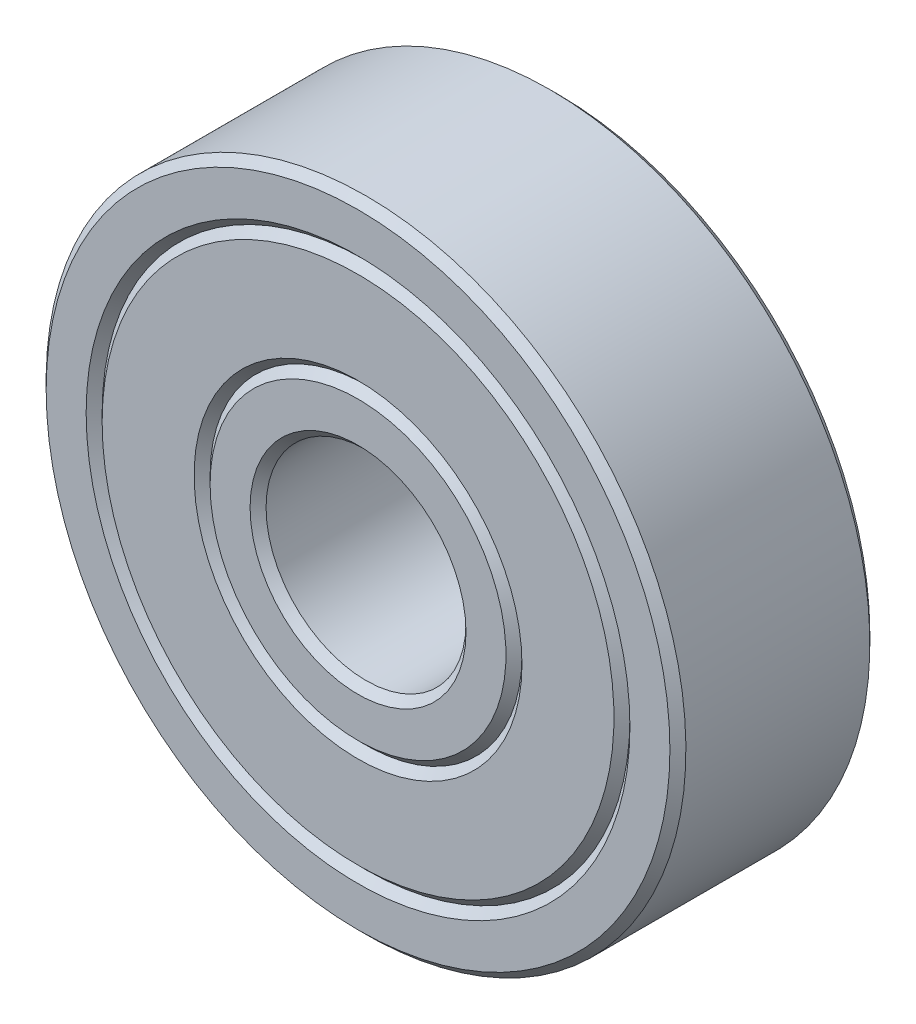
ISO-10303-21;
HEADER;
FILE_DESCRIPTION(('STEP AP214'),'2;1');
FILE_NAME('part.step','',(''),(''),'','','');
FILE_SCHEMA(('AUTOMOTIVE_DESIGN { 1 0 10303 214 1 1 1 1 }'));
ENDSEC;
DATA;
#1=APPLICATION_CONTEXT('core data for automotive mechanical design processes');
#2=APPLICATION_PROTOCOL_DEFINITION('international standard','automotive_design',2000,#1);
#3=PRODUCT_CONTEXT('',#1,'mechanical');
#4=PRODUCT('Part','Part','',(#3));
#5=PRODUCT_RELATED_PRODUCT_CATEGORY('part','',(#4));
#6=PRODUCT_DEFINITION_FORMATION('','',#4);
#7=PRODUCT_DEFINITION_CONTEXT('part definition',#1,'design');
#8=PRODUCT_DEFINITION('design','',#6,#7);
#9=PRODUCT_DEFINITION_SHAPE('','',#8);
#10=(LENGTH_UNIT() NAMED_UNIT(*) SI_UNIT(.MILLI.,.METRE.));
#11=(NAMED_UNIT(*) PLANE_ANGLE_UNIT() SI_UNIT($,.RADIAN.));
#12=(NAMED_UNIT(*) SI_UNIT($,.STERADIAN.) SOLID_ANGLE_UNIT());
#13=UNCERTAINTY_MEASURE_WITH_UNIT(LENGTH_MEASURE(1.E-05),#10,'distance_accuracy_value','');
#14=(GEOMETRIC_REPRESENTATION_CONTEXT(3) GLOBAL_UNCERTAINTY_ASSIGNED_CONTEXT((#13)) GLOBAL_UNIT_ASSIGNED_CONTEXT((#10,
#11,#12)) REPRESENTATION_CONTEXT('',''));
#15=CARTESIAN_POINT('',(0.,0.,0.));
#16=DIRECTION('',(0.,0.,1.));
#17=DIRECTION('',(1.,0.,0.));
#18=AXIS2_PLACEMENT_3D('',#15,#16,#17);
#19=CARTESIAN_POINT('',(0.,0.,-36.8));
#20=DIRECTION('',(0.,0.,1.));
#21=DIRECTION('',(0.,-1.,0.));
#22=AXIS2_PLACEMENT_3D('',#19,#20,#21);
#23=CYLINDRICAL_SURFACE('',#22,2.5);
#24=CARTESIAN_POINT('',(0.,0.,-32.1999999999321));
#25=DIRECTION('',(0.,0.,1.));
#26=DIRECTION('',(1.,0.,0.));
#27=AXIS2_PLACEMENT_3D('',#24,#25,#26);
#28=CIRCLE('',#27,2.49999999999773);
#29=CARTESIAN_POINT('',(2.49999999999773,0.,-32.1999999999321));
#30=VERTEX_POINT('',#29);
#31=EDGE_CURVE('E49',#30,#30,#28,.T.);
#32=ORIENTED_EDGE('',*,*,#31,.T.);
#33=EDGE_LOOP('',(#32));
#34=FACE_BOUND('',#33,.T.);
#35=CARTESIAN_POINT('',(0.,0.,-36.8000000000279));
#36=DIRECTION('',(0.,0.,-1.));
#37=DIRECTION('',(1.,0.,0.));
#38=AXIS2_PLACEMENT_3D('',#35,#36,#37);
#39=CIRCLE('',#38,2.49999999994088);
#40=CARTESIAN_POINT('',(2.49999999994088,0.,-36.8000000000279));
#41=VERTEX_POINT('',#40);
#42=EDGE_CURVE('E52',#41,#41,#39,.T.);
#43=ORIENTED_EDGE('',*,*,#42,.T.);
#44=EDGE_LOOP('',(#43));
#45=FACE_BOUND('',#44,.T.);
#46=ADVANCED_FACE('F14',(#34,#45),#23,.F.);
#47=CARTESIAN_POINT('',(0.,0.,-37.0000000001482));
#48=DIRECTION('',(0.,0.,-1.));
#49=DIRECTION('',(-1.,0.,0.));
#50=AXIS2_PLACEMENT_3D('',#47,#48,#49);
#51=CONICAL_SURFACE('',#50,2.70000000006121,0.78539816325534);
#52=CARTESIAN_POINT('',(0.,0.,-37.0000000000346));
#53=DIRECTION('',(0.,0.,-1.));
#54=DIRECTION('',(-1.,0.,0.));
#55=AXIS2_PLACEMENT_3D('',#52,#53,#54);
#56=CIRCLE('',#55,2.69999999994752);
#57=CARTESIAN_POINT('',(-2.69999999994752,0.,-37.0000000000346));
#58=VERTEX_POINT('',#57);
#59=EDGE_CURVE('E17',#58,#58,#56,.T.);
#60=ORIENTED_EDGE('',*,*,#59,.T.);
#61=EDGE_LOOP('',(#60));
#62=FACE_BOUND('',#61,.T.);
#63=ORIENTED_EDGE('',*,*,#42,.F.);
#64=EDGE_LOOP('',(#63));
#65=FACE_BOUND('',#64,.T.);
#66=ADVANCED_FACE('F90',(#62,#65),#51,.F.);
#67=CARTESIAN_POINT('',(0.,0.,-32.000000000096));
#68=DIRECTION('',(0.,0.,1.));
#69=DIRECTION('',(1.,0.,0.));
#70=AXIS2_PLACEMENT_3D('',#67,#68,#69);
#71=CONICAL_SURFACE('',#70,2.69999999989068,0.785398163539557);
#72=CARTESIAN_POINT('',(0.,0.,-32.0000000000391));
#73=DIRECTION('',(0.,0.,1.));
#74=DIRECTION('',(1.,0.,0.));
#75=AXIS2_PLACEMENT_3D('',#72,#73,#74);
#76=CIRCLE('',#75,2.69999999994752);
#77=CARTESIAN_POINT('',(2.69999999994752,0.,-32.0000000000391));
#78=VERTEX_POINT('',#77);
#79=EDGE_CURVE('E83',#78,#78,#76,.T.);
#80=ORIENTED_EDGE('',*,*,#79,.T.);
#81=EDGE_LOOP('',(#80));
#82=FACE_BOUND('',#81,.T.);
#83=ORIENTED_EDGE('',*,*,#31,.F.);
#84=EDGE_LOOP('',(#83));
#85=FACE_BOUND('',#84,.T.);
#86=ADVANCED_FACE('F97',(#82,#85),#71,.F.);
#87=CARTESIAN_POINT('',(0.,0.,-37.));
#88=DIRECTION('',(0.,0.,1.));
#89=DIRECTION('',(0.,-1.,0.));
#90=AXIS2_PLACEMENT_3D('',#87,#88,#89);
#91=PLANE('',#90);
#92=ORIENTED_EDGE('',*,*,#59,.F.);
#93=EDGE_LOOP('',(#92));
#94=FACE_BOUND('',#93,.T.);
#95=CARTESIAN_POINT('',(0.,0.,-36.9999999999209));
#96=DIRECTION('',(0.,0.,1.));
#97=DIRECTION('',(1.,0.,0.));
#98=AXIS2_PLACEMENT_3D('',#95,#96,#97);
#99=CIRCLE('',#98,3.69999999992388);
#100=CARTESIAN_POINT('',(3.69999999992388,0.,-36.9999999999209));
#101=VERTEX_POINT('',#100);
#102=EDGE_CURVE('E81',#101,#101,#99,.T.);
#103=ORIENTED_EDGE('',*,*,#102,.F.);
#104=EDGE_LOOP('',(#103));
#105=FACE_BOUND('',#104,.T.);
#106=ADVANCED_FACE('F93',(#94,#105),#91,.F.);
#107=CARTESIAN_POINT('',(0.,0.,-32.));
#108=DIRECTION('',(0.,0.,-1.));
#109=DIRECTION('',(0.,1.,0.));
#110=AXIS2_PLACEMENT_3D('',#107,#108,#109);
#111=PLANE('',#110);
#112=ORIENTED_EDGE('',*,*,#79,.F.);
#113=EDGE_LOOP('',(#112));
#114=FACE_BOUND('',#113,.T.);
#115=CARTESIAN_POINT('',(0.,0.,-32.0000000000391));
#116=DIRECTION('',(0.,0.,-1.));
#117=DIRECTION('',(-1.,0.,0.));
#118=AXIS2_PLACEMENT_3D('',#115,#116,#117);
#119=CIRCLE('',#118,3.70000000003756);
#120=CARTESIAN_POINT('',(-3.70000000003756,0.,-32.0000000000391));
#121=VERTEX_POINT('',#120);
#122=EDGE_CURVE('E48',#121,#121,#119,.T.);
#123=ORIENTED_EDGE('',*,*,#122,.F.);
#124=EDGE_LOOP('',(#123));
#125=FACE_BOUND('',#124,.T.);
#126=ADVANCED_FACE('F96',(#114,#125),#111,.F.);
#127=CARTESIAN_POINT('',(0.,0.,-36.7999999999142));
#128=DIRECTION('',(0.,0.,1.));
#129=DIRECTION('',(1.,0.,0.));
#130=AXIS2_PLACEMENT_3D('',#127,#128,#129);
#131=CONICAL_SURFACE('',#130,3.89999999993051,0.785398163397448);
#132=ORIENTED_EDGE('',*,*,#102,.T.);
#133=EDGE_LOOP('',(#132));
#134=FACE_BOUND('',#133,.T.);
#135=CARTESIAN_POINT('',(0.,0.,-36.8000000000279));
#136=DIRECTION('',(0.,0.,-1.));
#137=DIRECTION('',(1.,0.,0.));
#138=AXIS2_PLACEMENT_3D('',#135,#136,#137);
#139=CIRCLE('',#138,3.89999999998736);
#140=CARTESIAN_POINT('',(3.89999999998736,0.,-36.8000000000279));
#141=VERTEX_POINT('',#140);
#142=EDGE_CURVE('E45',#141,#141,#139,.T.);
#143=ORIENTED_EDGE('',*,*,#142,.T.);
#144=EDGE_LOOP('',(#143));
#145=FACE_BOUND('',#144,.T.);
#146=ADVANCED_FACE('F101',(#134,#145),#131,.T.);
#147=CARTESIAN_POINT('',(0.,0.,-32.1999999999889));
#148=DIRECTION('',(0.,0.,-1.));
#149=DIRECTION('',(-1.,0.,0.));
#150=AXIS2_PLACEMENT_3D('',#147,#148,#149);
#151=CONICAL_SURFACE('',#150,3.89999999993051,0.78539816325534);
#152=ORIENTED_EDGE('',*,*,#122,.T.);
#153=EDGE_LOOP('',(#152));
#154=FACE_BOUND('',#153,.T.);
#155=CARTESIAN_POINT('',(0.,0.,-32.2000000000457));
#156=DIRECTION('',(0.,0.,1.));
#157=DIRECTION('',(1.,0.,0.));
#158=AXIS2_PLACEMENT_3D('',#155,#156,#157);
#159=CIRCLE('',#158,3.89999999998736);
#160=CARTESIAN_POINT('',(3.89999999998736,0.,-32.2000000000457));
#161=VERTEX_POINT('',#160);
#162=EDGE_CURVE('E41',#161,#161,#159,.T.);
#163=ORIENTED_EDGE('',*,*,#162,.T.);
#164=EDGE_LOOP('',(#163));
#165=FACE_BOUND('',#164,.T.);
#166=ADVANCED_FACE('F104',(#154,#165),#151,.T.);
#167=CARTESIAN_POINT('',(0.,0.,-36.9999999999777));
#168=DIRECTION('',(0.,0.,-1.));
#169=DIRECTION('',(-1.,0.,0.));
#170=AXIS2_PLACEMENT_3D('',#167,#168,#169);
#171=CONICAL_SURFACE('',#170,4.09999999993715,0.785398163397448);
#172=CARTESIAN_POINT('',(0.,0.,-36.9999999999777));
#173=DIRECTION('',(0.,0.,-1.));
#174=DIRECTION('',(-1.,0.,0.));
#175=AXIS2_PLACEMENT_3D('',#172,#173,#174);
#176=CIRCLE('',#175,4.09999999993715);
#177=CARTESIAN_POINT('',(-4.09999999993715,0.,-36.9999999999777));
#178=VERTEX_POINT('',#177);
#179=EDGE_CURVE('E44',#178,#178,#176,.F.);
#180=ORIENTED_EDGE('',*,*,#179,.F.);
#181=EDGE_LOOP('',(#180));
#182=FACE_BOUND('',#181,.T.);
#183=ORIENTED_EDGE('',*,*,#142,.F.);
#184=EDGE_LOOP('',(#183));
#185=FACE_BOUND('',#184,.T.);
#186=ADVANCED_FACE('F108',(#182,#185),#171,.F.);
#187=CARTESIAN_POINT('',(0.,0.,-31.9999999999254));
#188=DIRECTION('',(0.,0.,1.));
#189=DIRECTION('',(1.,0.,0.));
#190=AXIS2_PLACEMENT_3D('',#187,#188,#189);
#191=CONICAL_SURFACE('',#190,4.10000000010768,0.785398163397448);
#192=CARTESIAN_POINT('',(0.,0.,-31.9999999999823));
#193=DIRECTION('',(0.,0.,1.));
#194=DIRECTION('',(1.,0.,0.));
#195=AXIS2_PLACEMENT_3D('',#192,#193,#194);
#196=CIRCLE('',#195,4.10000000005084);
#197=CARTESIAN_POINT('',(4.10000000005084,0.,-31.9999999999823));
#198=VERTEX_POINT('',#197);
#199=EDGE_CURVE('E74',#198,#198,#196,.T.);
#200=ORIENTED_EDGE('',*,*,#199,.T.);
#201=EDGE_LOOP('',(#200));
#202=FACE_BOUND('',#201,.T.);
#203=ORIENTED_EDGE('',*,*,#162,.F.);
#204=EDGE_LOOP('',(#203));
#205=FACE_BOUND('',#204,.T.);
#206=ADVANCED_FACE('F110',(#202,#205),#191,.F.);
#207=CARTESIAN_POINT('',(0.,0.,-37.));
#208=DIRECTION('',(0.,0.,-1.));
#209=DIRECTION('',(0.,1.,0.));
#210=AXIS2_PLACEMENT_3D('',#207,#208,#209);
#211=PLANE('',#210);
#212=ORIENTED_EDGE('',*,*,#179,.T.);
#213=EDGE_LOOP('',(#212));
#214=FACE_BOUND('',#213,.T.);
#215=CARTESIAN_POINT('',(0.,0.,-36.9999999999777));
#216=DIRECTION('',(0.,0.,1.));
#217=DIRECTION('',(1.,0.,0.));
#218=AXIS2_PLACEMENT_3D('',#215,#216,#217);
#219=CIRCLE('',#218,6.39999999992824);
#220=CARTESIAN_POINT('',(6.39999999992824,0.,-36.9999999999777));
#221=VERTEX_POINT('',#220);
#222=EDGE_CURVE('E71',#221,#221,#219,.T.);
#223=ORIENTED_EDGE('',*,*,#222,.F.);
#224=EDGE_LOOP('',(#223));
#225=FACE_BOUND('',#224,.T.);
#226=ADVANCED_FACE('F118',(#214,#225),#211,.T.);
#227=CARTESIAN_POINT('',(0.,0.,-32.));
#228=DIRECTION('',(0.,0.,-1.));
#229=DIRECTION('',(0.,1.,0.));
#230=AXIS2_PLACEMENT_3D('',#227,#228,#229);
#231=PLANE('',#230);
#232=ORIENTED_EDGE('',*,*,#199,.F.);
#233=EDGE_LOOP('',(#232));
#234=FACE_BOUND('',#233,.T.);
#235=CARTESIAN_POINT('',(0.,0.,-31.9999999999254));
#236=DIRECTION('',(0.,0.,-1.));
#237=DIRECTION('',(-1.,0.,0.));
#238=AXIS2_PLACEMENT_3D('',#235,#236,#237);
#239=CIRCLE('',#238,6.39999999998508);
#240=CARTESIAN_POINT('',(-6.39999999998508,0.,-31.9999999999254));
#241=VERTEX_POINT('',#240);
#242=EDGE_CURVE('E40',#241,#241,#239,.T.);
#243=ORIENTED_EDGE('',*,*,#242,.F.);
#244=EDGE_LOOP('',(#243));
#245=FACE_BOUND('',#244,.T.);
#246=ADVANCED_FACE('F162',(#234,#245),#231,.F.);
#247=CARTESIAN_POINT('',(0.,0.,-36.8000000001416));
#248=DIRECTION('',(0.,0.,1.));
#249=DIRECTION('',(1.,0.,0.));
#250=AXIS2_PLACEMENT_3D('',#247,#248,#249);
#251=CONICAL_SURFACE('',#250,6.59999999976435,0.785398163397448);
#252=ORIENTED_EDGE('',*,*,#222,.T.);
#253=EDGE_LOOP('',(#252));
#254=FACE_BOUND('',#253,.T.);
#255=CARTESIAN_POINT('',(0.,0.,-36.8000000000279));
#256=DIRECTION('',(0.,0.,-1.));
#257=DIRECTION('',(1.,0.,0.));
#258=AXIS2_PLACEMENT_3D('',#255,#256,#257);
#259=CIRCLE('',#258,6.59999999999172);
#260=CARTESIAN_POINT('',(6.59999999999172,0.,-36.8000000000279));
#261=VERTEX_POINT('',#260);
#262=EDGE_CURVE('E37',#261,#261,#259,.T.);
#263=ORIENTED_EDGE('',*,*,#262,.T.);
#264=EDGE_LOOP('',(#263));
#265=FACE_BOUND('',#264,.T.);
#266=ADVANCED_FACE('F158',(#254,#265),#251,.T.);
#267=CARTESIAN_POINT('',(0.,0.,-32.1999999998752));
#268=DIRECTION('',(0.,0.,-1.));
#269=DIRECTION('',(-1.,0.,0.));
#270=AXIS2_PLACEMENT_3D('',#267,#268,#269);
#271=CONICAL_SURFACE('',#270,6.59999999999172,0.785398163539557);
#272=ORIENTED_EDGE('',*,*,#242,.T.);
#273=EDGE_LOOP('',(#272));
#274=FACE_BOUND('',#273,.T.);
#275=CARTESIAN_POINT('',(0.,0.,-32.1999999999321));
#276=DIRECTION('',(0.,0.,1.));
#277=DIRECTION('',(1.,0.,0.));
#278=AXIS2_PLACEMENT_3D('',#275,#276,#277);
#279=CIRCLE('',#278,6.59999999999172);
#280=CARTESIAN_POINT('',(6.59999999999172,0.,-32.1999999999321));
#281=VERTEX_POINT('',#280);
#282=EDGE_CURVE('E33',#281,#281,#279,.T.);
#283=ORIENTED_EDGE('',*,*,#282,.T.);
#284=EDGE_LOOP('',(#283));
#285=FACE_BOUND('',#284,.T.);
#286=ADVANCED_FACE('F154',(#274,#285),#271,.T.);
#287=CARTESIAN_POINT('',(0.,0.,-36.999999999864));
#288=DIRECTION('',(0.,0.,-1.));
#289=DIRECTION('',(-1.,0.,0.));
#290=AXIS2_PLACEMENT_3D('',#287,#288,#289);
#291=CONICAL_SURFACE('',#290,6.79999999982783,0.785398163397448);
#292=CARTESIAN_POINT('',(0.,0.,-36.9999999999777));
#293=DIRECTION('',(0.,0.,-1.));
#294=DIRECTION('',(-1.,0.,0.));
#295=AXIS2_PLACEMENT_3D('',#292,#293,#294);
#296=CIRCLE('',#295,6.79999999994152);
#297=CARTESIAN_POINT('',(-6.79999999994152,0.,-36.9999999999777));
#298=VERTEX_POINT('',#297);
#299=EDGE_CURVE('E36',#298,#298,#296,.F.);
#300=ORIENTED_EDGE('',*,*,#299,.F.);
#301=EDGE_LOOP('',(#300));
#302=FACE_BOUND('',#301,.T.);
#303=ORIENTED_EDGE('',*,*,#262,.F.);
#304=EDGE_LOOP('',(#303));
#305=FACE_BOUND('',#304,.T.);
#306=ADVANCED_FACE('F150',(#302,#305),#291,.F.);
#307=CARTESIAN_POINT('',(0.,0.,-31.9999999999254));
#308=DIRECTION('',(0.,0.,1.));
#309=DIRECTION('',(1.,0.,0.));
#310=AXIS2_PLACEMENT_3D('',#307,#308,#309);
#311=CONICAL_SURFACE('',#310,6.79999999999836,0.785398163397448);
#312=CARTESIAN_POINT('',(0.,0.,-31.9999999999254));
#313=DIRECTION('',(0.,0.,1.));
#314=DIRECTION('',(1.,0.,0.));
#315=AXIS2_PLACEMENT_3D('',#312,#313,#314);
#316=CIRCLE('',#315,6.79999999999836);
#317=CARTESIAN_POINT('',(6.79999999999836,0.,-31.9999999999254));
#318=VERTEX_POINT('',#317);
#319=EDGE_CURVE('E64',#318,#318,#316,.T.);
#320=ORIENTED_EDGE('',*,*,#319,.T.);
#321=EDGE_LOOP('',(#320));
#322=FACE_BOUND('',#321,.T.);
#323=ORIENTED_EDGE('',*,*,#282,.F.);
#324=EDGE_LOOP('',(#323));
#325=FACE_BOUND('',#324,.T.);
#326=ADVANCED_FACE('F146',(#322,#325),#311,.F.);
#327=CARTESIAN_POINT('',(0.,0.,-37.));
#328=DIRECTION('',(0.,0.,-1.));
#329=DIRECTION('',(0.,1.,0.));
#330=AXIS2_PLACEMENT_3D('',#327,#328,#329);
#331=PLANE('',#330);
#332=ORIENTED_EDGE('',*,*,#299,.T.);
#333=EDGE_LOOP('',(#332));
#334=FACE_BOUND('',#333,.T.);
#335=CARTESIAN_POINT('',(0.,0.,-37.));
#336=DIRECTION('',(0.,0.,1.));
#337=DIRECTION('',(0.,-1.,0.));
#338=AXIS2_PLACEMENT_3D('',#335,#336,#337);
#339=CIRCLE('',#338,7.8);
#340=CARTESIAN_POINT('',(0.,-7.8,-37.));
#341=VERTEX_POINT('',#340);
#342=EDGE_CURVE('E61',#341,#341,#339,.T.);
#343=ORIENTED_EDGE('',*,*,#342,.F.);
#344=EDGE_LOOP('',(#343));
#345=FACE_BOUND('',#344,.T.);
#346=ADVANCED_FACE('F142',(#334,#345),#331,.T.);
#347=CARTESIAN_POINT('',(0.,0.,-32.));
#348=DIRECTION('',(0.,0.,-1.));
#349=DIRECTION('',(0.,1.,0.));
#350=AXIS2_PLACEMENT_3D('',#347,#348,#349);
#351=PLANE('',#350);
#352=ORIENTED_EDGE('',*,*,#319,.F.);
#353=EDGE_LOOP('',(#352));
#354=FACE_BOUND('',#353,.T.);
#355=CARTESIAN_POINT('',(0.,0.,-31.9999999999999));
#356=DIRECTION('',(0.,0.,-1.));
#357=DIRECTION('',(0.,1.,0.));
#358=AXIS2_PLACEMENT_3D('',#355,#356,#357);
#359=CIRCLE('',#358,7.80000000000008);
#360=CARTESIAN_POINT('',(0.,7.80000000000008,-31.9999999999999));
#361=VERTEX_POINT('',#360);
#362=EDGE_CURVE('E26',#361,#361,#359,.T.);
#363=ORIENTED_EDGE('',*,*,#362,.F.);
#364=EDGE_LOOP('',(#363));
#365=FACE_BOUND('',#364,.T.);
#366=ADVANCED_FACE('F138',(#354,#365),#351,.F.);
#367=CARTESIAN_POINT('',(0.,0.,-36.7999999999999));
#368=DIRECTION('',(0.,0.,1.));
#369=DIRECTION('',(0.,-1.,0.));
#370=AXIS2_PLACEMENT_3D('',#367,#368,#369);
#371=CONICAL_SURFACE('',#370,7.99999999999991,0.785398163397002);
#372=ORIENTED_EDGE('',*,*,#342,.T.);
#373=EDGE_LOOP('',(#372));
#374=FACE_BOUND('',#373,.T.);
#375=CARTESIAN_POINT('',(0.,0.,-36.8));
#376=DIRECTION('',(0.,0.,-1.));
#377=DIRECTION('',(0.,1.,0.));
#378=AXIS2_PLACEMENT_3D('',#375,#376,#377);
#379=CIRCLE('',#378,8.);
#380=CARTESIAN_POINT('',(0.,8.,-36.8));
#381=VERTEX_POINT('',#380);
#382=EDGE_CURVE('E21',#381,#381,#379,.F.);
#383=ORIENTED_EDGE('',*,*,#382,.F.);
#384=EDGE_LOOP('',(#383));
#385=FACE_BOUND('',#384,.T.);
#386=ADVANCED_FACE('F131',(#374,#385),#371,.T.);
#387=CARTESIAN_POINT('',(0.,0.,-32.2));
#388=DIRECTION('',(0.,0.,-1.));
#389=DIRECTION('',(0.,1.,0.));
#390=AXIS2_PLACEMENT_3D('',#387,#388,#389);
#391=CONICAL_SURFACE('',#390,8.,0.785398163396999);
#392=ORIENTED_EDGE('',*,*,#362,.T.);
#393=EDGE_LOOP('',(#392));
#394=FACE_BOUND('',#393,.T.);
#395=CARTESIAN_POINT('',(0.,0.,-32.2));
#396=DIRECTION('',(0.,0.,-1.));
#397=DIRECTION('',(0.,1.,0.));
#398=AXIS2_PLACEMENT_3D('',#395,#396,#397);
#399=CIRCLE('',#398,8.);
#400=CARTESIAN_POINT('',(0.,8.,-32.2));
#401=VERTEX_POINT('',#400);
#402=EDGE_CURVE('E10',#401,#401,#399,.T.);
#403=ORIENTED_EDGE('',*,*,#402,.F.);
#404=EDGE_LOOP('',(#403));
#405=FACE_BOUND('',#404,.T.);
#406=ADVANCED_FACE('F126',(#394,#405),#391,.T.);
#407=CARTESIAN_POINT('',(0.,0.,-32.2));
#408=DIRECTION('',(0.,0.,-1.));
#409=DIRECTION('',(0.,1.,0.));
#410=AXIS2_PLACEMENT_3D('',#407,#408,#409);
#411=CYLINDRICAL_SURFACE('',#410,8.);
#412=ORIENTED_EDGE('',*,*,#402,.T.);
#413=EDGE_LOOP('',(#412));
#414=FACE_BOUND('',#413,.T.);
#415=ORIENTED_EDGE('',*,*,#382,.T.);
#416=EDGE_LOOP('',(#415));
#417=FACE_BOUND('',#416,.T.);
#418=ADVANCED_FACE('F124',(#414,#417),#411,.T.);
#419=CLOSED_SHELL('',(#46,#66,#86,#106,#126,#146,#166,#186,#206,#226,#246,#266,#286,#306,#326,
#346,#366,#386,#406,#418));
#420=MANIFOLD_SOLID_BREP('B1',#419);
#421=ADVANCED_BREP_SHAPE_REPRESENTATION('',(#18,#420),#14);
#422=SHAPE_DEFINITION_REPRESENTATION(#9,#421);
ENDSEC;
END-ISO-10303-21;
